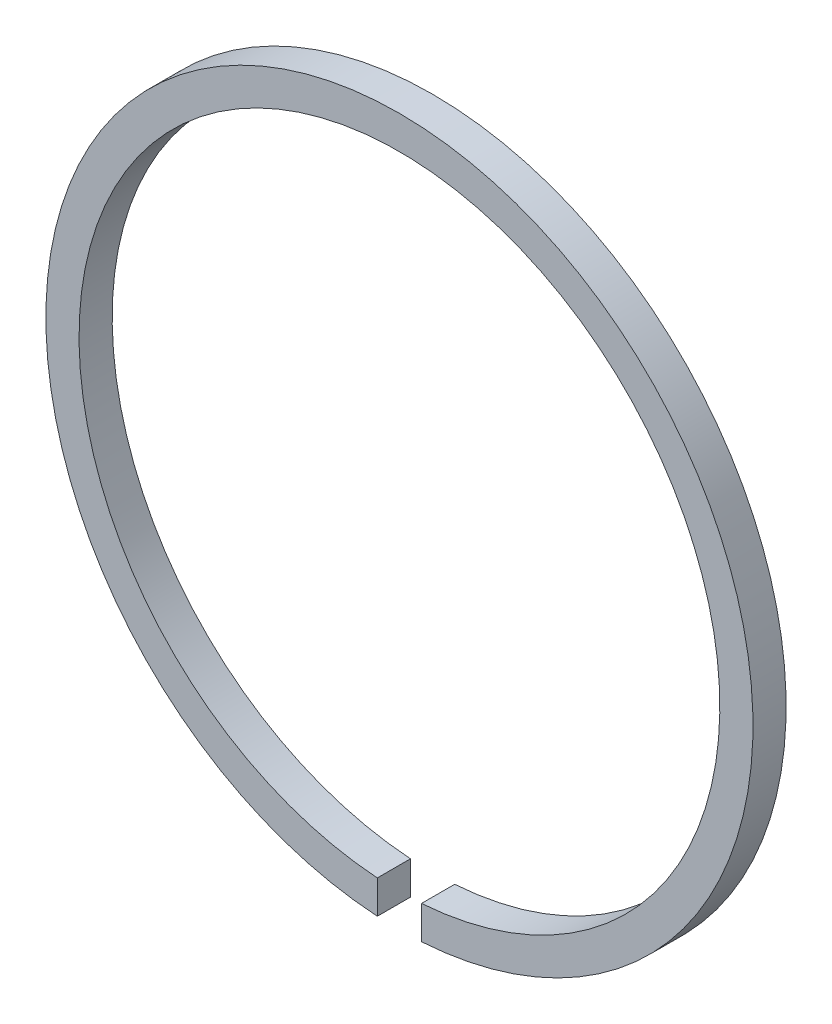
ISO-10303-21;
HEADER;
FILE_DESCRIPTION(('STEP AP214'),'2;1');
FILE_NAME('part.step','',(''),(''),'','','');
FILE_SCHEMA(('AUTOMOTIVE_DESIGN { 1 0 10303 214 1 1 1 1 }'));
ENDSEC;
DATA;
#1=APPLICATION_CONTEXT('core data for automotive mechanical design processes');
#2=APPLICATION_PROTOCOL_DEFINITION('international standard','automotive_design',2000,#1);
#3=PRODUCT_CONTEXT('',#1,'mechanical');
#4=PRODUCT('Part','Part','',(#3));
#5=PRODUCT_RELATED_PRODUCT_CATEGORY('part','',(#4));
#6=PRODUCT_DEFINITION_FORMATION('','',#4);
#7=PRODUCT_DEFINITION_CONTEXT('part definition',#1,'design');
#8=PRODUCT_DEFINITION('design','',#6,#7);
#9=PRODUCT_DEFINITION_SHAPE('','',#8);
#10=(LENGTH_UNIT() NAMED_UNIT(*) SI_UNIT(.MILLI.,.METRE.));
#11=(NAMED_UNIT(*) PLANE_ANGLE_UNIT() SI_UNIT($,.RADIAN.));
#12=(NAMED_UNIT(*) SI_UNIT($,.STERADIAN.) SOLID_ANGLE_UNIT());
#13=UNCERTAINTY_MEASURE_WITH_UNIT(LENGTH_MEASURE(1.E-05),#10,'distance_accuracy_value','');
#14=(GEOMETRIC_REPRESENTATION_CONTEXT(3) GLOBAL_UNCERTAINTY_ASSIGNED_CONTEXT((#13)) GLOBAL_UNIT_ASSIGNED_CONTEXT((#10,
#11,#12)) REPRESENTATION_CONTEXT('',''));
#15=CARTESIAN_POINT('',(0.,0.,0.));
#16=DIRECTION('',(0.,0.,1.));
#17=DIRECTION('',(1.,0.,0.));
#18=AXIS2_PLACEMENT_3D('',#15,#16,#17);
#19=CARTESIAN_POINT('',(0.,0.,0.75));
#20=DIRECTION('',(0.,0.,-1.));
#21=DIRECTION('',(-1.,0.,0.));
#22=AXIS2_PLACEMENT_3D('',#19,#20,#21);
#23=CYLINDRICAL_SURFACE('',#22,16.);
#24=CARTESIAN_POINT('',(0.,0.,-0.75));
#25=DIRECTION('',(0.,0.,1.));
#26=DIRECTION('',(1.,0.,0.));
#27=AXIS2_PLACEMENT_3D('',#24,#25,#26);
#28=CIRCLE('',#27,16.);
#29=CARTESIAN_POINT('',(1.,-15.9687194226713,-0.75));
#30=VERTEX_POINT('',#29);
#31=CARTESIAN_POINT('',(-1.,-15.9687194226713,-0.75));
#32=VERTEX_POINT('',#31);
#33=EDGE_CURVE('E100',#30,#32,#28,.T.);
#34=ORIENTED_EDGE('',*,*,#33,.T.);
#35=DIRECTION('',(0.,0.,-1.));
#36=VECTOR('',#35,1.);
#37=CARTESIAN_POINT('',(-1.,-15.9687194226713,0.75));
#38=LINE('',#37,#36);
#39=CARTESIAN_POINT('',(-1.,-15.9687194226713,0.75));
#40=VERTEX_POINT('',#39);
#41=EDGE_CURVE('E11',#40,#32,#38,.T.);
#42=ORIENTED_EDGE('',*,*,#41,.F.);
#43=CARTESIAN_POINT('',(0.,0.,0.75));
#44=DIRECTION('',(0.,0.,1.));
#45=DIRECTION('',(1.,0.,0.));
#46=AXIS2_PLACEMENT_3D('',#43,#44,#45);
#47=CIRCLE('',#46,16.);
#48=CARTESIAN_POINT('',(1.,-15.9687194226713,0.75));
#49=VERTEX_POINT('',#48);
#50=EDGE_CURVE('E88',#49,#40,#47,.T.);
#51=ORIENTED_EDGE('',*,*,#50,.F.);
#52=DIRECTION('',(0.,0.,-1.));
#53=VECTOR('',#52,1.);
#54=CARTESIAN_POINT('',(1.,-15.9687194226713,0.75));
#55=LINE('',#54,#53);
#56=EDGE_CURVE('E96',#49,#30,#55,.T.);
#57=ORIENTED_EDGE('',*,*,#56,.T.);
#58=EDGE_LOOP('',(#34,#42,#51,#57));
#59=FACE_BOUND('',#58,.T.);
#60=ADVANCED_FACE('F37',(#59),#23,.T.);
#61=CARTESIAN_POINT('',(-1.,-14.4654761414894,0.75));
#62=DIRECTION('',(-1.,0.,0.));
#63=DIRECTION('',(0.,0.,1.));
#64=AXIS2_PLACEMENT_3D('',#61,#62,#63);
#65=PLANE('',#64);
#66=DIRECTION('',(0.,1.,0.));
#67=VECTOR('',#66,1.);
#68=CARTESIAN_POINT('',(-1.,-14.4654761414894,-0.75));
#69=LINE('',#68,#67);
#70=CARTESIAN_POINT('',(-1.,-14.4654761414894,-0.75));
#71=VERTEX_POINT('',#70);
#72=EDGE_CURVE('E92',#32,#71,#69,.T.);
#73=ORIENTED_EDGE('',*,*,#72,.T.);
#74=DIRECTION('',(0.,0.,-1.));
#75=VECTOR('',#74,1.);
#76=CARTESIAN_POINT('',(-1.,-14.4654761414894,0.75));
#77=LINE('',#76,#75);
#78=CARTESIAN_POINT('',(-1.,-14.4654761414894,0.75));
#79=VERTEX_POINT('',#78);
#80=EDGE_CURVE('E45',#79,#71,#77,.T.);
#81=ORIENTED_EDGE('',*,*,#80,.F.);
#82=DIRECTION('',(0.,1.,0.));
#83=VECTOR('',#82,1.);
#84=CARTESIAN_POINT('',(-1.,-14.4654761414894,0.75));
#85=LINE('',#84,#83);
#86=EDGE_CURVE('E83',#40,#79,#85,.T.);
#87=ORIENTED_EDGE('',*,*,#86,.F.);
#88=ORIENTED_EDGE('',*,*,#41,.T.);
#89=EDGE_LOOP('',(#73,#81,#87,#88));
#90=FACE_BOUND('',#89,.T.);
#91=ADVANCED_FACE('F91',(#90),#65,.F.);
#92=CARTESIAN_POINT('',(0.,0.,0.75));
#93=DIRECTION('',(0.,0.,-1.));
#94=DIRECTION('',(-1.,0.,0.));
#95=AXIS2_PLACEMENT_3D('',#92,#93,#94);
#96=CYLINDRICAL_SURFACE('',#95,14.5);
#97=CARTESIAN_POINT('',(0.,0.,-0.75));
#98=DIRECTION('',(0.,0.,-1.));
#99=DIRECTION('',(1.,0.,0.));
#100=AXIS2_PLACEMENT_3D('',#97,#98,#99);
#101=CIRCLE('',#100,14.5);
#102=CARTESIAN_POINT('',(1.,-14.4654761414894,-0.75));
#103=VERTEX_POINT('',#102);
#104=EDGE_CURVE('E70',#71,#103,#101,.T.);
#105=ORIENTED_EDGE('',*,*,#104,.T.);
#106=DIRECTION('',(0.,0.,-1.));
#107=VECTOR('',#106,1.);
#108=CARTESIAN_POINT('',(1.,-14.4654761414894,0.75));
#109=LINE('',#108,#107);
#110=CARTESIAN_POINT('',(1.,-14.4654761414894,0.75));
#111=VERTEX_POINT('',#110);
#112=EDGE_CURVE('E93',#111,#103,#109,.T.);
#113=ORIENTED_EDGE('',*,*,#112,.F.);
#114=CARTESIAN_POINT('',(0.,0.,0.75));
#115=DIRECTION('',(0.,0.,-1.));
#116=DIRECTION('',(1.,0.,0.));
#117=AXIS2_PLACEMENT_3D('',#114,#115,#116);
#118=CIRCLE('',#117,14.5);
#119=EDGE_CURVE('E86',#79,#111,#118,.T.);
#120=ORIENTED_EDGE('',*,*,#119,.F.);
#121=ORIENTED_EDGE('',*,*,#80,.T.);
#122=EDGE_LOOP('',(#105,#113,#120,#121));
#123=FACE_BOUND('',#122,.T.);
#124=ADVANCED_FACE('F94',(#123),#96,.F.);
#125=CARTESIAN_POINT('',(1.,-14.4654761414894,0.75));
#126=DIRECTION('',(1.,0.,0.));
#127=DIRECTION('',(0.,0.,-1.));
#128=AXIS2_PLACEMENT_3D('',#125,#126,#127);
#129=PLANE('',#128);
#130=DIRECTION('',(0.,-1.,0.));
#131=VECTOR('',#130,1.);
#132=CARTESIAN_POINT('',(1.,-14.4654761414894,-0.75));
#133=LINE('',#132,#131);
#134=EDGE_CURVE('E76',#103,#30,#133,.T.);
#135=ORIENTED_EDGE('',*,*,#134,.T.);
#136=ORIENTED_EDGE('',*,*,#56,.F.);
#137=DIRECTION('',(0.,-1.,0.));
#138=VECTOR('',#137,1.);
#139=CARTESIAN_POINT('',(1.,-14.4654761414894,0.75));
#140=LINE('',#139,#138);
#141=EDGE_CURVE('E53',#111,#49,#140,.T.);
#142=ORIENTED_EDGE('',*,*,#141,.F.);
#143=ORIENTED_EDGE('',*,*,#112,.T.);
#144=EDGE_LOOP('',(#135,#136,#142,#143));
#145=FACE_BOUND('',#144,.T.);
#146=ADVANCED_FACE('F107',(#145),#129,.F.);
#147=CARTESIAN_POINT('',(0.,0.,0.75));
#148=DIRECTION('',(0.,0.,1.));
#149=DIRECTION('',(1.,0.,0.));
#150=AXIS2_PLACEMENT_3D('',#147,#148,#149);
#151=PLANE('',#150);
#152=ORIENTED_EDGE('',*,*,#50,.T.);
#153=ORIENTED_EDGE('',*,*,#86,.T.);
#154=ORIENTED_EDGE('',*,*,#119,.T.);
#155=ORIENTED_EDGE('',*,*,#141,.T.);
#156=EDGE_LOOP('',(#152,#153,#154,#155));
#157=FACE_BOUND('',#156,.T.);
#158=ADVANCED_FACE('F84',(#157),#151,.T.);
#159=CARTESIAN_POINT('',(0.,0.,-0.75));
#160=DIRECTION('',(0.,0.,1.));
#161=DIRECTION('',(1.,0.,0.));
#162=AXIS2_PLACEMENT_3D('',#159,#160,#161);
#163=PLANE('',#162);
#164=ORIENTED_EDGE('',*,*,#33,.F.);
#165=ORIENTED_EDGE('',*,*,#134,.F.);
#166=ORIENTED_EDGE('',*,*,#104,.F.);
#167=ORIENTED_EDGE('',*,*,#72,.F.);
#168=EDGE_LOOP('',(#164,#165,#166,#167));
#169=FACE_BOUND('',#168,.T.);
#170=ADVANCED_FACE('F110',(#169),#163,.F.);
#171=CLOSED_SHELL('',(#60,#91,#124,#146,#158,#170));
#172=MANIFOLD_SOLID_BREP('B2',#171);
#173=ADVANCED_BREP_SHAPE_REPRESENTATION('',(#18,#172),#14);
#174=SHAPE_DEFINITION_REPRESENTATION(#9,#173);
ENDSEC;
END-ISO-10303-21;
